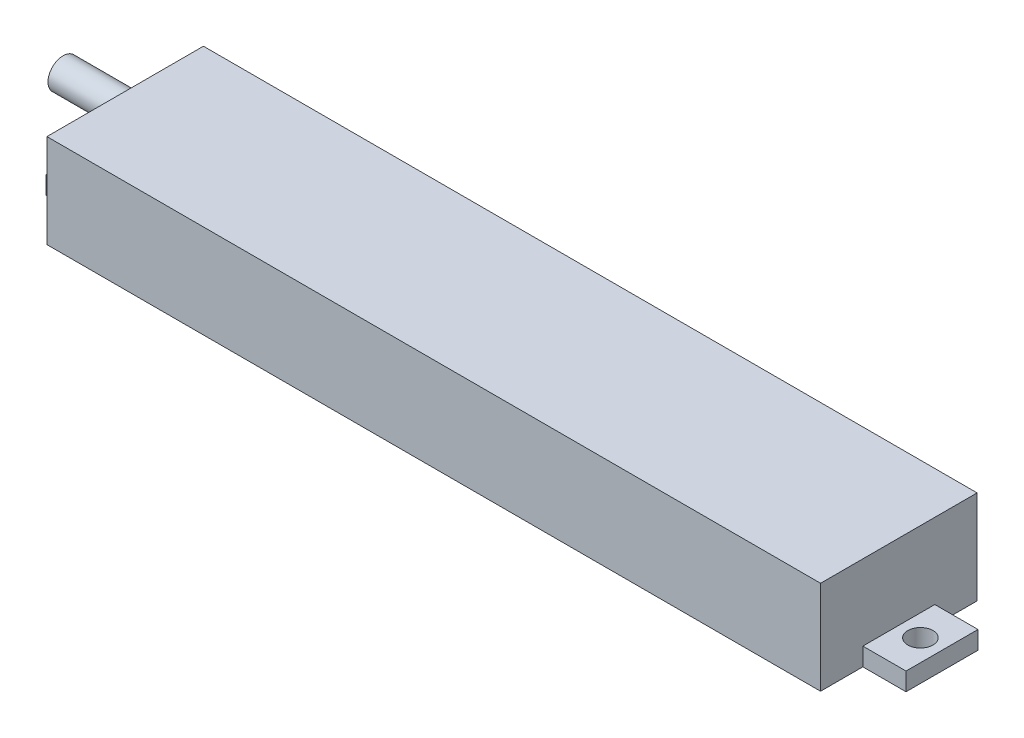
ISO-10303-21;
HEADER;
FILE_DESCRIPTION(('STEP AP214'),'2;1');
FILE_NAME('part.step','',(''),(''),'','','');
FILE_SCHEMA(('AUTOMOTIVE_DESIGN { 1 0 10303 214 1 1 1 1 }'));
ENDSEC;
DATA;
#1=APPLICATION_CONTEXT('core data for automotive mechanical design processes');
#2=APPLICATION_PROTOCOL_DEFINITION('international standard','automotive_design',2000,#1);
#3=PRODUCT_CONTEXT('',#1,'mechanical');
#4=PRODUCT('Part','Part','',(#3));
#5=PRODUCT_RELATED_PRODUCT_CATEGORY('part','',(#4));
#6=PRODUCT_DEFINITION_FORMATION('','',#4);
#7=PRODUCT_DEFINITION_CONTEXT('part definition',#1,'design');
#8=PRODUCT_DEFINITION('design','',#6,#7);
#9=PRODUCT_DEFINITION_SHAPE('','',#8);
#10=(LENGTH_UNIT() NAMED_UNIT(*) SI_UNIT(.MILLI.,.METRE.));
#11=(NAMED_UNIT(*) PLANE_ANGLE_UNIT() SI_UNIT($,.RADIAN.));
#12=(NAMED_UNIT(*) SI_UNIT($,.STERADIAN.) SOLID_ANGLE_UNIT());
#13=UNCERTAINTY_MEASURE_WITH_UNIT(LENGTH_MEASURE(1.E-05),#10,'distance_accuracy_value','');
#14=(GEOMETRIC_REPRESENTATION_CONTEXT(3) GLOBAL_UNCERTAINTY_ASSIGNED_CONTEXT((#13)) GLOBAL_UNIT_ASSIGNED_CONTEXT((#10,
#11,#12)) REPRESENTATION_CONTEXT('',''));
#15=CARTESIAN_POINT('',(0.,0.,0.));
#16=DIRECTION('',(0.,0.,1.));
#17=DIRECTION('',(1.,0.,0.));
#18=AXIS2_PLACEMENT_3D('',#15,#16,#17);
#19=CARTESIAN_POINT('',(107.5,26.,-21.75));
#20=DIRECTION('',(-1.,0.,0.));
#21=DIRECTION('',(0.,0.,1.));
#22=AXIS2_PLACEMENT_3D('',#19,#20,#21);
#23=PLANE('',#22);
#24=DIRECTION('',(0.,-1.,0.));
#25=VECTOR('',#24,1.);
#26=CARTESIAN_POINT('',(107.5,5.,10.));
#27=LINE('',#26,#25);
#28=CARTESIAN_POINT('',(107.5,5.,10.));
#29=VERTEX_POINT('',#28);
#30=CARTESIAN_POINT('',(107.5,0.,10.));
#31=VERTEX_POINT('',#30);
#32=EDGE_CURVE('E160',#29,#31,#27,.T.);
#33=ORIENTED_EDGE('',*,*,#32,.F.);
#34=DIRECTION('',(0.,0.,-1.));
#35=VECTOR('',#34,1.);
#36=CARTESIAN_POINT('',(107.5,5.,-10.));
#37=LINE('',#36,#35);
#38=CARTESIAN_POINT('',(107.5,5.,-10.));
#39=VERTEX_POINT('',#38);
#40=EDGE_CURVE('E132',#29,#39,#37,.T.);
#41=ORIENTED_EDGE('',*,*,#40,.T.);
#42=DIRECTION('',(0.,-1.,0.));
#43=VECTOR('',#42,1.);
#44=CARTESIAN_POINT('',(107.5,5.,-10.));
#45=LINE('',#44,#43);
#46=CARTESIAN_POINT('',(107.5,0.,-10.));
#47=VERTEX_POINT('',#46);
#48=EDGE_CURVE('E144',#39,#47,#45,.T.);
#49=ORIENTED_EDGE('',*,*,#48,.T.);
#50=DIRECTION('',(0.,0.,-1.));
#51=VECTOR('',#50,1.);
#52=CARTESIAN_POINT('',(107.5,0.,-21.75));
#53=LINE('',#52,#51);
#54=CARTESIAN_POINT('',(107.5,0.,-21.75));
#55=VERTEX_POINT('',#54);
#56=EDGE_CURVE('E212',#47,#55,#53,.T.);
#57=ORIENTED_EDGE('',*,*,#56,.T.);
#58=DIRECTION('',(0.,-1.,0.));
#59=VECTOR('',#58,1.);
#60=CARTESIAN_POINT('',(107.5,26.,-21.75));
#61=LINE('',#60,#59);
#62=CARTESIAN_POINT('',(107.5,26.,-21.75));
#63=VERTEX_POINT('',#62);
#64=EDGE_CURVE('E219',#63,#55,#61,.T.);
#65=ORIENTED_EDGE('',*,*,#64,.F.);
#66=DIRECTION('',(0.,0.,-1.));
#67=VECTOR('',#66,1.);
#68=CARTESIAN_POINT('',(107.5,26.,-21.75));
#69=LINE('',#68,#67);
#70=CARTESIAN_POINT('',(107.5,26.,21.75));
#71=VERTEX_POINT('',#70);
#72=EDGE_CURVE('E202',#71,#63,#69,.T.);
#73=ORIENTED_EDGE('',*,*,#72,.F.);
#74=DIRECTION('',(0.,-1.,0.));
#75=VECTOR('',#74,1.);
#76=CARTESIAN_POINT('',(107.5,26.,21.75));
#77=LINE('',#76,#75);
#78=CARTESIAN_POINT('',(107.5,0.,21.75));
#79=VERTEX_POINT('',#78);
#80=EDGE_CURVE('E222',#71,#79,#77,.T.);
#81=ORIENTED_EDGE('',*,*,#80,.T.);
#82=EDGE_CURVE('E213',#79,#31,#53,.T.);
#83=ORIENTED_EDGE('',*,*,#82,.T.);
#84=EDGE_LOOP('',(#33,#41,#49,#57,#65,#73,#81,#83));
#85=FACE_BOUND('',#84,.T.);
#86=ADVANCED_FACE('F35',(#85),#23,.F.);
#87=CARTESIAN_POINT('',(-107.5,26.,-21.75));
#88=DIRECTION('',(1.,0.,0.));
#89=DIRECTION('',(0.,0.,-1.));
#90=AXIS2_PLACEMENT_3D('',#87,#88,#89);
#91=PLANE('',#90);
#92=CARTESIAN_POINT('',(-107.5,14.,-7.75));
#93=DIRECTION('',(1.,0.,0.));
#94=DIRECTION('',(0.,0.,-1.));
#95=AXIS2_PLACEMENT_3D('',#92,#93,#94);
#96=CIRCLE('',#95,4.2);
#97=CARTESIAN_POINT('',(-107.5,14.,-11.95));
#98=VERTEX_POINT('',#97);
#99=EDGE_CURVE('E11',#98,#98,#96,.F.);
#100=ORIENTED_EDGE('',*,*,#99,.F.);
#101=EDGE_LOOP('',(#100));
#102=FACE_BOUND('',#101,.T.);
#103=DIRECTION('',(0.,-1.,0.));
#104=VECTOR('',#103,1.);
#105=CARTESIAN_POINT('',(-107.5,5.,-10.));
#106=LINE('',#105,#104);
#107=CARTESIAN_POINT('',(-107.5,5.,-10.));
#108=VERTEX_POINT('',#107);
#109=CARTESIAN_POINT('',(-107.5,0.,-10.));
#110=VERTEX_POINT('',#109);
#111=EDGE_CURVE('E193',#108,#110,#106,.T.);
#112=ORIENTED_EDGE('',*,*,#111,.F.);
#113=DIRECTION('',(0.,0.,1.));
#114=VECTOR('',#113,1.);
#115=CARTESIAN_POINT('',(-107.5,5.,-10.));
#116=LINE('',#115,#114);
#117=CARTESIAN_POINT('',(-107.5,5.,10.));
#118=VERTEX_POINT('',#117);
#119=EDGE_CURVE('E175',#108,#118,#116,.T.);
#120=ORIENTED_EDGE('',*,*,#119,.T.);
#121=DIRECTION('',(0.,-1.,0.));
#122=VECTOR('',#121,1.);
#123=CARTESIAN_POINT('',(-107.5,5.,10.));
#124=LINE('',#123,#122);
#125=CARTESIAN_POINT('',(-107.5,0.,10.));
#126=VERTEX_POINT('',#125);
#127=EDGE_CURVE('E191',#118,#126,#124,.T.);
#128=ORIENTED_EDGE('',*,*,#127,.T.);
#129=DIRECTION('',(0.,0.,1.));
#130=VECTOR('',#129,1.);
#131=CARTESIAN_POINT('',(-107.5,0.,-21.75));
#132=LINE('',#131,#130);
#133=CARTESIAN_POINT('',(-107.5,0.,21.75));
#134=VERTEX_POINT('',#133);
#135=EDGE_CURVE('E190',#126,#134,#132,.T.);
#136=ORIENTED_EDGE('',*,*,#135,.T.);
#137=DIRECTION('',(0.,-1.,0.));
#138=VECTOR('',#137,1.);
#139=CARTESIAN_POINT('',(-107.5,26.,21.75));
#140=LINE('',#139,#138);
#141=CARTESIAN_POINT('',(-107.5,26.,21.75));
#142=VERTEX_POINT('',#141);
#143=EDGE_CURVE('E43',#142,#134,#140,.T.);
#144=ORIENTED_EDGE('',*,*,#143,.F.);
#145=DIRECTION('',(0.,0.,1.));
#146=VECTOR('',#145,1.);
#147=CARTESIAN_POINT('',(-107.5,26.,-21.75));
#148=LINE('',#147,#146);
#149=CARTESIAN_POINT('',(-107.5,26.,-21.75));
#150=VERTEX_POINT('',#149);
#151=EDGE_CURVE('E196',#150,#142,#148,.T.);
#152=ORIENTED_EDGE('',*,*,#151,.F.);
#153=DIRECTION('',(0.,-1.,0.));
#154=VECTOR('',#153,1.);
#155=CARTESIAN_POINT('',(-107.5,26.,-21.75));
#156=LINE('',#155,#154);
#157=CARTESIAN_POINT('',(-107.5,0.,-21.75));
#158=VERTEX_POINT('',#157);
#159=EDGE_CURVE('E206',#150,#158,#156,.T.);
#160=ORIENTED_EDGE('',*,*,#159,.T.);
#161=EDGE_CURVE('E207',#158,#110,#132,.T.);
#162=ORIENTED_EDGE('',*,*,#161,.T.);
#163=EDGE_LOOP('',(#112,#120,#128,#136,#144,#152,#160,#162));
#164=FACE_BOUND('',#163,.T.);
#165=ADVANCED_FACE('F37',(#102,#164),#91,.F.);
#166=CARTESIAN_POINT('',(-107.5,26.,21.75));
#167=DIRECTION('',(0.,0.,-1.));
#168=DIRECTION('',(-1.,0.,0.));
#169=AXIS2_PLACEMENT_3D('',#166,#167,#168);
#170=PLANE('',#169);
#171=DIRECTION('',(1.,0.,0.));
#172=VECTOR('',#171,1.);
#173=CARTESIAN_POINT('',(-107.5,0.,21.75));
#174=LINE('',#173,#172);
#175=EDGE_CURVE('E210',#134,#79,#174,.T.);
#176=ORIENTED_EDGE('',*,*,#175,.T.);
#177=ORIENTED_EDGE('',*,*,#80,.F.);
#178=DIRECTION('',(1.,0.,0.));
#179=VECTOR('',#178,1.);
#180=CARTESIAN_POINT('',(-107.5,26.,21.75));
#181=LINE('',#180,#179);
#182=EDGE_CURVE('E199',#142,#71,#181,.T.);
#183=ORIENTED_EDGE('',*,*,#182,.F.);
#184=ORIENTED_EDGE('',*,*,#143,.T.);
#185=EDGE_LOOP('',(#176,#177,#183,#184));
#186=FACE_BOUND('',#185,.T.);
#187=ADVANCED_FACE('F227',(#186),#170,.F.);
#188=CARTESIAN_POINT('',(-107.5,26.,-21.75));
#189=DIRECTION('',(0.,0.,1.));
#190=DIRECTION('',(1.,0.,0.));
#191=AXIS2_PLACEMENT_3D('',#188,#189,#190);
#192=PLANE('',#191);
#193=DIRECTION('',(-1.,0.,0.));
#194=VECTOR('',#193,1.);
#195=CARTESIAN_POINT('',(-107.5,0.,-21.75));
#196=LINE('',#195,#194);
#197=EDGE_CURVE('E200',#55,#158,#196,.T.);
#198=ORIENTED_EDGE('',*,*,#197,.T.);
#199=ORIENTED_EDGE('',*,*,#159,.F.);
#200=DIRECTION('',(-1.,0.,0.));
#201=VECTOR('',#200,1.);
#202=CARTESIAN_POINT('',(-107.5,26.,-21.75));
#203=LINE('',#202,#201);
#204=EDGE_CURVE('E204',#63,#150,#203,.T.);
#205=ORIENTED_EDGE('',*,*,#204,.F.);
#206=ORIENTED_EDGE('',*,*,#64,.T.);
#207=EDGE_LOOP('',(#198,#199,#205,#206));
#208=FACE_BOUND('',#207,.T.);
#209=ADVANCED_FACE('F249',(#208),#192,.F.);
#210=CARTESIAN_POINT('',(0.,26.,0.));
#211=DIRECTION('',(0.,1.,0.));
#212=DIRECTION('',(0.,0.,1.));
#213=AXIS2_PLACEMENT_3D('',#210,#211,#212);
#214=PLANE('',#213);
#215=ORIENTED_EDGE('',*,*,#151,.T.);
#216=ORIENTED_EDGE('',*,*,#182,.T.);
#217=ORIENTED_EDGE('',*,*,#72,.T.);
#218=ORIENTED_EDGE('',*,*,#204,.T.);
#219=EDGE_LOOP('',(#215,#216,#217,#218));
#220=FACE_BOUND('',#219,.T.);
#221=ADVANCED_FACE('F246',(#220),#214,.T.);
#222=CARTESIAN_POINT('',(0.,0.,0.));
#223=DIRECTION('',(0.,1.,0.));
#224=DIRECTION('',(0.,0.,1.));
#225=AXIS2_PLACEMENT_3D('',#222,#223,#224);
#226=PLANE('',#225);
#227=ORIENTED_EDGE('',*,*,#161,.F.);
#228=ORIENTED_EDGE('',*,*,#197,.F.);
#229=ORIENTED_EDGE('',*,*,#56,.F.);
#230=DIRECTION('',(1.,0.,0.));
#231=VECTOR('',#230,1.);
#232=CARTESIAN_POINT('',(119.5,0.,-10.));
#233=LINE('',#232,#231);
#234=CARTESIAN_POINT('',(119.5,0.,-10.));
#235=VERTEX_POINT('',#234);
#236=EDGE_CURVE('E50',#47,#235,#233,.T.);
#237=ORIENTED_EDGE('',*,*,#236,.T.);
#238=DIRECTION('',(0.,0.,1.));
#239=VECTOR('',#238,1.);
#240=CARTESIAN_POINT('',(119.5,0.,-10.));
#241=LINE('',#240,#239);
#242=CARTESIAN_POINT('',(119.5,0.,10.));
#243=VERTEX_POINT('',#242);
#244=EDGE_CURVE('E129',#235,#243,#241,.T.);
#245=ORIENTED_EDGE('',*,*,#244,.T.);
#246=DIRECTION('',(-1.,0.,0.));
#247=VECTOR('',#246,1.);
#248=CARTESIAN_POINT('',(119.5,0.,10.));
#249=LINE('',#248,#247);
#250=EDGE_CURVE('E145',#243,#31,#249,.T.);
#251=ORIENTED_EDGE('',*,*,#250,.T.);
#252=ORIENTED_EDGE('',*,*,#82,.F.);
#253=ORIENTED_EDGE('',*,*,#175,.F.);
#254=ORIENTED_EDGE('',*,*,#135,.F.);
#255=DIRECTION('',(-1.,0.,0.));
#256=VECTOR('',#255,1.);
#257=CARTESIAN_POINT('',(-119.5,0.,10.));
#258=LINE('',#257,#256);
#259=CARTESIAN_POINT('',(-119.5,0.,10.));
#260=VERTEX_POINT('',#259);
#261=EDGE_CURVE('E58',#126,#260,#258,.T.);
#262=ORIENTED_EDGE('',*,*,#261,.T.);
#263=DIRECTION('',(0.,0.,-1.));
#264=VECTOR('',#263,1.);
#265=CARTESIAN_POINT('',(-119.5,0.,-10.));
#266=LINE('',#265,#264);
#267=CARTESIAN_POINT('',(-119.5,0.,-10.));
#268=VERTEX_POINT('',#267);
#269=EDGE_CURVE('E166',#260,#268,#266,.T.);
#270=ORIENTED_EDGE('',*,*,#269,.T.);
#271=DIRECTION('',(1.,0.,0.));
#272=VECTOR('',#271,1.);
#273=CARTESIAN_POINT('',(-119.5,0.,-10.));
#274=LINE('',#273,#272);
#275=EDGE_CURVE('E184',#268,#110,#274,.T.);
#276=ORIENTED_EDGE('',*,*,#275,.T.);
#277=EDGE_LOOP('',(#227,#228,#229,#237,#245,#251,#252,#253,#254,#262,#270,#276));
#278=FACE_BOUND('',#277,.T.);
#279=CARTESIAN_POINT('',(-113.5,0.,0.));
#280=DIRECTION('',(0.,-1.,0.));
#281=DIRECTION('',(0.,0.,-1.));
#282=AXIS2_PLACEMENT_3D('',#279,#280,#281);
#283=CIRCLE('',#282,3.50000000000001);
#284=CARTESIAN_POINT('',(-113.5,0.,-3.50000000000001));
#285=VERTEX_POINT('',#284);
#286=EDGE_CURVE('E159',#285,#285,#283,.T.);
#287=ORIENTED_EDGE('',*,*,#286,.F.);
#288=EDGE_LOOP('',(#287));
#289=FACE_BOUND('',#288,.T.);
#290=CARTESIAN_POINT('',(113.5,0.,0.));
#291=DIRECTION('',(0.,-1.,0.));
#292=DIRECTION('',(0.,0.,1.));
#293=AXIS2_PLACEMENT_3D('',#290,#291,#292);
#294=CIRCLE('',#293,3.50000000000001);
#295=CARTESIAN_POINT('',(113.5,0.,3.50000000000001));
#296=VERTEX_POINT('',#295);
#297=EDGE_CURVE('E150',#296,#296,#294,.T.);
#298=ORIENTED_EDGE('',*,*,#297,.F.);
#299=EDGE_LOOP('',(#298));
#300=FACE_BOUND('',#299,.T.);
#301=ADVANCED_FACE('F237',(#278,#289,#300),#226,.F.);
#302=CARTESIAN_POINT('',(-119.5,5.,-10.));
#303=DIRECTION('',(-1.,0.,0.));
#304=DIRECTION('',(0.,0.,1.));
#305=AXIS2_PLACEMENT_3D('',#302,#303,#304);
#306=PLANE('',#305);
#307=ORIENTED_EDGE('',*,*,#269,.F.);
#308=DIRECTION('',(0.,-1.,0.));
#309=VECTOR('',#308,1.);
#310=CARTESIAN_POINT('',(-119.5,5.,10.));
#311=LINE('',#310,#309);
#312=CARTESIAN_POINT('',(-119.5,5.,10.));
#313=VERTEX_POINT('',#312);
#314=EDGE_CURVE('E188',#313,#260,#311,.T.);
#315=ORIENTED_EDGE('',*,*,#314,.F.);
#316=DIRECTION('',(0.,0.,-1.));
#317=VECTOR('',#316,1.);
#318=CARTESIAN_POINT('',(-119.5,5.,-10.));
#319=LINE('',#318,#317);
#320=CARTESIAN_POINT('',(-119.5,5.,-10.));
#321=VERTEX_POINT('',#320);
#322=EDGE_CURVE('E169',#313,#321,#319,.T.);
#323=ORIENTED_EDGE('',*,*,#322,.T.);
#324=DIRECTION('',(0.,-1.,0.));
#325=VECTOR('',#324,1.);
#326=CARTESIAN_POINT('',(-119.5,5.,-10.));
#327=LINE('',#326,#325);
#328=EDGE_CURVE('E181',#321,#268,#327,.T.);
#329=ORIENTED_EDGE('',*,*,#328,.T.);
#330=EDGE_LOOP('',(#307,#315,#323,#329));
#331=FACE_BOUND('',#330,.T.);
#332=ADVANCED_FACE('F263',(#331),#306,.T.);
#333=CARTESIAN_POINT('',(-119.5,5.,10.));
#334=DIRECTION('',(0.,0.,1.));
#335=DIRECTION('',(1.,0.,0.));
#336=AXIS2_PLACEMENT_3D('',#333,#334,#335);
#337=PLANE('',#336);
#338=ORIENTED_EDGE('',*,*,#261,.F.);
#339=ORIENTED_EDGE('',*,*,#127,.F.);
#340=DIRECTION('',(-1.,0.,0.));
#341=VECTOR('',#340,1.);
#342=CARTESIAN_POINT('',(-119.5,5.,10.));
#343=LINE('',#342,#341);
#344=EDGE_CURVE('E178',#118,#313,#343,.T.);
#345=ORIENTED_EDGE('',*,*,#344,.T.);
#346=ORIENTED_EDGE('',*,*,#314,.T.);
#347=EDGE_LOOP('',(#338,#339,#345,#346));
#348=FACE_BOUND('',#347,.T.);
#349=ADVANCED_FACE('F261',(#348),#337,.T.);
#350=CARTESIAN_POINT('',(-119.5,5.,-10.));
#351=DIRECTION('',(0.,0.,-1.));
#352=DIRECTION('',(-1.,0.,0.));
#353=AXIS2_PLACEMENT_3D('',#350,#351,#352);
#354=PLANE('',#353);
#355=ORIENTED_EDGE('',*,*,#275,.F.);
#356=ORIENTED_EDGE('',*,*,#328,.F.);
#357=DIRECTION('',(1.,0.,0.));
#358=VECTOR('',#357,1.);
#359=CARTESIAN_POINT('',(-119.5,5.,-10.));
#360=LINE('',#359,#358);
#361=EDGE_CURVE('E172',#321,#108,#360,.T.);
#362=ORIENTED_EDGE('',*,*,#361,.T.);
#363=ORIENTED_EDGE('',*,*,#111,.T.);
#364=EDGE_LOOP('',(#355,#356,#362,#363));
#365=FACE_BOUND('',#364,.T.);
#366=ADVANCED_FACE('F255',(#365),#354,.T.);
#367=CARTESIAN_POINT('',(0.,5.,0.));
#368=DIRECTION('',(0.,1.,0.));
#369=DIRECTION('',(0.,0.,1.));
#370=AXIS2_PLACEMENT_3D('',#367,#368,#369);
#371=PLANE('',#370);
#372=CARTESIAN_POINT('',(-113.5,5.,0.));
#373=DIRECTION('',(0.,-1.,0.));
#374=DIRECTION('',(0.,0.,-1.));
#375=AXIS2_PLACEMENT_3D('',#372,#373,#374);
#376=CIRCLE('',#375,3.50000000000001);
#377=CARTESIAN_POINT('',(-113.5,5.,-3.50000000000001));
#378=VERTEX_POINT('',#377);
#379=EDGE_CURVE('E163',#378,#378,#376,.T.);
#380=ORIENTED_EDGE('',*,*,#379,.T.);
#381=EDGE_LOOP('',(#380));
#382=FACE_BOUND('',#381,.T.);
#383=ORIENTED_EDGE('',*,*,#322,.F.);
#384=ORIENTED_EDGE('',*,*,#344,.F.);
#385=ORIENTED_EDGE('',*,*,#119,.F.);
#386=ORIENTED_EDGE('',*,*,#361,.F.);
#387=EDGE_LOOP('',(#383,#384,#385,#386));
#388=FACE_BOUND('',#387,.T.);
#389=ADVANCED_FACE('F260',(#382,#388),#371,.T.);
#390=CARTESIAN_POINT('',(-113.5,5.,0.));
#391=DIRECTION('',(0.,-1.,0.));
#392=DIRECTION('',(0.,0.,-1.));
#393=AXIS2_PLACEMENT_3D('',#390,#391,#392);
#394=CYLINDRICAL_SURFACE('',#393,3.50000000000001);
#395=ORIENTED_EDGE('',*,*,#379,.F.);
#396=EDGE_LOOP('',(#395));
#397=FACE_BOUND('',#396,.T.);
#398=ORIENTED_EDGE('',*,*,#286,.T.);
#399=EDGE_LOOP('',(#398));
#400=FACE_BOUND('',#399,.T.);
#401=ADVANCED_FACE('F324',(#397,#400),#394,.F.);
#402=CARTESIAN_POINT('',(119.5,5.,-10.));
#403=DIRECTION('',(0.,0.,-1.));
#404=DIRECTION('',(-1.,0.,0.));
#405=AXIS2_PLACEMENT_3D('',#402,#403,#404);
#406=PLANE('',#405);
#407=ORIENTED_EDGE('',*,*,#236,.F.);
#408=ORIENTED_EDGE('',*,*,#48,.F.);
#409=DIRECTION('',(1.,0.,0.));
#410=VECTOR('',#409,1.);
#411=CARTESIAN_POINT('',(119.5,5.,-10.));
#412=LINE('',#411,#410);
#413=CARTESIAN_POINT('',(119.5,5.,-10.));
#414=VERTEX_POINT('',#413);
#415=EDGE_CURVE('E139',#39,#414,#412,.T.);
#416=ORIENTED_EDGE('',*,*,#415,.T.);
#417=DIRECTION('',(0.,-1.,0.));
#418=VECTOR('',#417,1.);
#419=CARTESIAN_POINT('',(119.5,5.,-10.));
#420=LINE('',#419,#418);
#421=EDGE_CURVE('E124',#414,#235,#420,.T.);
#422=ORIENTED_EDGE('',*,*,#421,.T.);
#423=EDGE_LOOP('',(#407,#408,#416,#422));
#424=FACE_BOUND('',#423,.T.);
#425=ADVANCED_FACE('F143',(#424),#406,.T.);
#426=CARTESIAN_POINT('',(119.5,5.,10.));
#427=DIRECTION('',(0.,0.,1.));
#428=DIRECTION('',(1.,0.,0.));
#429=AXIS2_PLACEMENT_3D('',#426,#427,#428);
#430=PLANE('',#429);
#431=ORIENTED_EDGE('',*,*,#250,.F.);
#432=DIRECTION('',(0.,-1.,0.));
#433=VECTOR('',#432,1.);
#434=CARTESIAN_POINT('',(119.5,5.,10.));
#435=LINE('',#434,#433);
#436=CARTESIAN_POINT('',(119.5,5.,10.));
#437=VERTEX_POINT('',#436);
#438=EDGE_CURVE('E131',#437,#243,#435,.T.);
#439=ORIENTED_EDGE('',*,*,#438,.F.);
#440=DIRECTION('',(-1.,0.,0.));
#441=VECTOR('',#440,1.);
#442=CARTESIAN_POINT('',(119.5,5.,10.));
#443=LINE('',#442,#441);
#444=EDGE_CURVE('E141',#437,#29,#443,.T.);
#445=ORIENTED_EDGE('',*,*,#444,.T.);
#446=ORIENTED_EDGE('',*,*,#32,.T.);
#447=EDGE_LOOP('',(#431,#439,#445,#446));
#448=FACE_BOUND('',#447,.T.);
#449=ADVANCED_FACE('F343',(#448),#430,.T.);
#450=CARTESIAN_POINT('',(119.5,5.,-10.));
#451=DIRECTION('',(1.,0.,0.));
#452=DIRECTION('',(0.,0.,-1.));
#453=AXIS2_PLACEMENT_3D('',#450,#451,#452);
#454=PLANE('',#453);
#455=ORIENTED_EDGE('',*,*,#244,.F.);
#456=ORIENTED_EDGE('',*,*,#421,.F.);
#457=DIRECTION('',(0.,0.,1.));
#458=VECTOR('',#457,1.);
#459=CARTESIAN_POINT('',(119.5,5.,-10.));
#460=LINE('',#459,#458);
#461=EDGE_CURVE('E127',#414,#437,#460,.T.);
#462=ORIENTED_EDGE('',*,*,#461,.T.);
#463=ORIENTED_EDGE('',*,*,#438,.T.);
#464=EDGE_LOOP('',(#455,#456,#462,#463));
#465=FACE_BOUND('',#464,.T.);
#466=ADVANCED_FACE('F126',(#465),#454,.T.);
#467=CARTESIAN_POINT('',(0.,5.,0.));
#468=DIRECTION('',(0.,1.,0.));
#469=DIRECTION('',(0.,0.,1.));
#470=AXIS2_PLACEMENT_3D('',#467,#468,#469);
#471=PLANE('',#470);
#472=CARTESIAN_POINT('',(113.5,5.,0.));
#473=DIRECTION('',(0.,-1.,0.));
#474=DIRECTION('',(0.,0.,1.));
#475=AXIS2_PLACEMENT_3D('',#472,#473,#474);
#476=CIRCLE('',#475,3.50000000000001);
#477=CARTESIAN_POINT('',(113.5,5.,3.50000000000001));
#478=VERTEX_POINT('',#477);
#479=EDGE_CURVE('E156',#478,#478,#476,.T.);
#480=ORIENTED_EDGE('',*,*,#479,.T.);
#481=EDGE_LOOP('',(#480));
#482=FACE_BOUND('',#481,.T.);
#483=ORIENTED_EDGE('',*,*,#415,.F.);
#484=ORIENTED_EDGE('',*,*,#40,.F.);
#485=ORIENTED_EDGE('',*,*,#444,.F.);
#486=ORIENTED_EDGE('',*,*,#461,.F.);
#487=EDGE_LOOP('',(#483,#484,#485,#486));
#488=FACE_BOUND('',#487,.T.);
#489=ADVANCED_FACE('F137',(#482,#488),#471,.T.);
#490=CARTESIAN_POINT('',(113.5,5.,0.));
#491=DIRECTION('',(0.,-1.,0.));
#492=DIRECTION('',(0.,0.,-1.));
#493=AXIS2_PLACEMENT_3D('',#490,#491,#492);
#494=CYLINDRICAL_SURFACE('',#493,3.50000000000001);
#495=ORIENTED_EDGE('',*,*,#479,.F.);
#496=EDGE_LOOP('',(#495));
#497=FACE_BOUND('',#496,.T.);
#498=ORIENTED_EDGE('',*,*,#297,.T.);
#499=EDGE_LOOP('',(#498));
#500=FACE_BOUND('',#499,.T.);
#501=ADVANCED_FACE('F369',(#497,#500),#494,.F.);
#502=CARTESIAN_POINT('',(-132.5,14.,-7.75));
#503=DIRECTION('',(1.,0.,0.));
#504=DIRECTION('',(0.,0.,-1.));
#505=AXIS2_PLACEMENT_3D('',#502,#503,#504);
#506=CYLINDRICAL_SURFACE('',#505,4.2);
#507=CARTESIAN_POINT('',(-132.5,14.,-7.75));
#508=DIRECTION('',(-1.,0.,0.));
#509=DIRECTION('',(0.,0.,1.));
#510=AXIS2_PLACEMENT_3D('',#507,#508,#509);
#511=CIRCLE('',#510,4.2);
#512=CARTESIAN_POINT('',(-132.5,14.,-3.55));
#513=VERTEX_POINT('',#512);
#514=EDGE_CURVE('E408',#513,#513,#511,.T.);
#515=ORIENTED_EDGE('',*,*,#514,.F.);
#516=EDGE_LOOP('',(#515));
#517=FACE_BOUND('',#516,.T.);
#518=ORIENTED_EDGE('',*,*,#99,.T.);
#519=EDGE_LOOP('',(#518));
#520=FACE_BOUND('',#519,.T.);
#521=ADVANCED_FACE('F378',(#517,#520),#506,.T.);
#522=CARTESIAN_POINT('',(-132.5,14.,-7.75));
#523=DIRECTION('',(-1.,0.,0.));
#524=DIRECTION('',(0.,0.,1.));
#525=AXIS2_PLACEMENT_3D('',#522,#523,#524);
#526=PLANE('',#525);
#527=ORIENTED_EDGE('',*,*,#514,.T.);
#528=EDGE_LOOP('',(#527));
#529=FACE_BOUND('',#528,.T.);
#530=ADVANCED_FACE('F392',(#529),#526,.T.);
#531=CLOSED_SHELL('',(#86,#165,#187,#209,#221,#301,#332,#349,#366,#389,#401,#425,#449,#466,#489,
#501,#521,#530));
#532=MANIFOLD_SOLID_BREP('B2',#531);
#533=ADVANCED_BREP_SHAPE_REPRESENTATION('',(#18,#532),#14);
#534=SHAPE_DEFINITION_REPRESENTATION(#9,#533);
ENDSEC;
END-ISO-10303-21;
